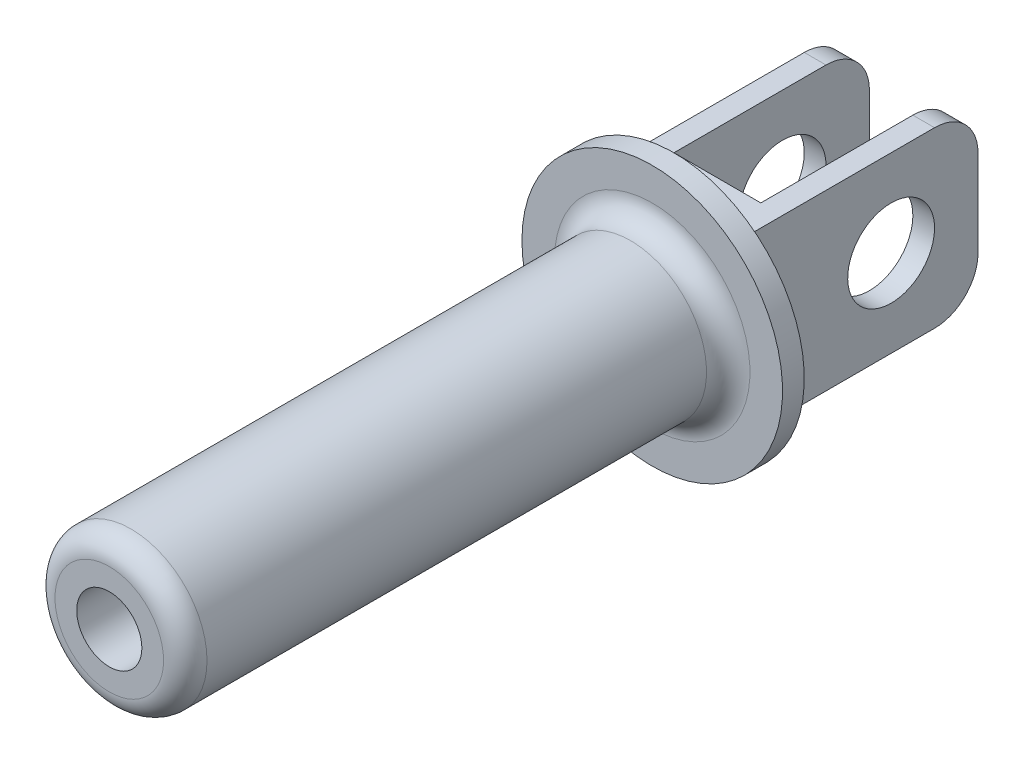
ISO-10303-21;
HEADER;
FILE_DESCRIPTION(('STEP AP214'),'2;1');
FILE_NAME('part.step','',(''),(''),'','','');
FILE_SCHEMA(('AUTOMOTIVE_DESIGN { 1 0 10303 214 1 1 1 1 }'));
ENDSEC;
DATA;
#1=APPLICATION_CONTEXT('core data for automotive mechanical design processes');
#2=APPLICATION_PROTOCOL_DEFINITION('international standard','automotive_design',2000,#1);
#3=PRODUCT_CONTEXT('',#1,'mechanical');
#4=PRODUCT('Part','Part','',(#3));
#5=PRODUCT_RELATED_PRODUCT_CATEGORY('part','',(#4));
#6=PRODUCT_DEFINITION_FORMATION('','',#4);
#7=PRODUCT_DEFINITION_CONTEXT('part definition',#1,'design');
#8=PRODUCT_DEFINITION('design','',#6,#7);
#9=PRODUCT_DEFINITION_SHAPE('','',#8);
#10=(LENGTH_UNIT() NAMED_UNIT(*) SI_UNIT(.MILLI.,.METRE.));
#11=(NAMED_UNIT(*) PLANE_ANGLE_UNIT() SI_UNIT($,.RADIAN.));
#12=(NAMED_UNIT(*) SI_UNIT($,.STERADIAN.) SOLID_ANGLE_UNIT());
#13=UNCERTAINTY_MEASURE_WITH_UNIT(LENGTH_MEASURE(1.E-05),#10,'distance_accuracy_value','');
#14=(GEOMETRIC_REPRESENTATION_CONTEXT(3) GLOBAL_UNCERTAINTY_ASSIGNED_CONTEXT((#13)) GLOBAL_UNIT_ASSIGNED_CONTEXT((#10,
#11,#12)) REPRESENTATION_CONTEXT('',''));
#15=CARTESIAN_POINT('',(0.,0.,0.));
#16=DIRECTION('',(0.,0.,1.));
#17=DIRECTION('',(1.,0.,0.));
#18=AXIS2_PLACEMENT_3D('',#15,#16,#17);
#19=CARTESIAN_POINT('',(0.,0.,-30.));
#20=DIRECTION('',(0.,0.,-1.));
#21=DIRECTION('',(-1.,0.,0.));
#22=AXIS2_PLACEMENT_3D('',#19,#20,#21);
#23=PLANE('',#22);
#24=DIRECTION('',(0.,1.,0.));
#25=VECTOR('',#24,1.);
#26=CARTESIAN_POINT('',(-7.5,10.,-30.));
#27=LINE('',#26,#25);
#28=CARTESIAN_POINT('',(-7.5,-5.,-30.));
#29=VERTEX_POINT('',#28);
#30=CARTESIAN_POINT('',(-7.5,5.,-30.));
#31=VERTEX_POINT('',#30);
#32=EDGE_CURVE('E169',#29,#31,#27,.T.);
#33=ORIENTED_EDGE('',*,*,#32,.T.);
#34=DIRECTION('',(1.,0.,0.));
#35=VECTOR('',#34,1.);
#36=CARTESIAN_POINT('',(-5.,5.,-30.));
#37=LINE('',#36,#35);
#38=CARTESIAN_POINT('',(-5.,5.,-30.));
#39=VERTEX_POINT('',#38);
#40=EDGE_CURVE('E238',#31,#39,#37,.T.);
#41=ORIENTED_EDGE('',*,*,#40,.T.);
#42=DIRECTION('',(0.,1.,0.));
#43=VECTOR('',#42,1.);
#44=CARTESIAN_POINT('',(-5.,-10.,-30.));
#45=LINE('',#44,#43);
#46=CARTESIAN_POINT('',(-5.,-5.,-30.));
#47=VERTEX_POINT('',#46);
#48=EDGE_CURVE('E149',#47,#39,#45,.T.);
#49=ORIENTED_EDGE('',*,*,#48,.F.);
#50=DIRECTION('',(-1.,0.,0.));
#51=VECTOR('',#50,1.);
#52=CARTESIAN_POINT('',(-7.5,-5.,-30.));
#53=LINE('',#52,#51);
#54=EDGE_CURVE('E236',#47,#29,#53,.T.);
#55=ORIENTED_EDGE('',*,*,#54,.T.);
#56=EDGE_LOOP('',(#33,#41,#49,#55));
#57=FACE_BOUND('',#56,.T.);
#58=ADVANCED_FACE('F39',(#57),#23,.T.);
#59=CARTESIAN_POINT('',(0.,0.,-2.5));
#60=DIRECTION('',(0.,0.,-1.));
#61=DIRECTION('',(-1.,0.,0.));
#62=AXIS2_PLACEMENT_3D('',#59,#60,#61);
#63=PLANE('',#62);
#64=CARTESIAN_POINT('',(0.,0.,-2.5));
#65=DIRECTION('',(0.,0.,-1.));
#66=DIRECTION('',(-1.,0.,0.));
#67=AXIS2_PLACEMENT_3D('',#64,#65,#66);
#68=CIRCLE('',#67,15.);
#69=CARTESIAN_POINT('',(-15.,0.,-2.5));
#70=VERTEX_POINT('',#69);
#71=EDGE_CURVE('E194',#70,#70,#68,.T.);
#72=ORIENTED_EDGE('',*,*,#71,.T.);
#73=EDGE_LOOP('',(#72));
#74=FACE_BOUND('',#73,.T.);
#75=DIRECTION('',(1.,0.,0.));
#76=VECTOR('',#75,1.);
#77=CARTESIAN_POINT('',(7.5,10.,-2.5));
#78=LINE('',#77,#76);
#79=CARTESIAN_POINT('',(-7.5,10.,-2.5));
#80=VERTEX_POINT('',#79);
#81=CARTESIAN_POINT('',(7.5,10.,-2.5));
#82=VERTEX_POINT('',#81);
#83=EDGE_CURVE('E178',#80,#82,#78,.T.);
#84=ORIENTED_EDGE('',*,*,#83,.F.);
#85=DIRECTION('',(0.,1.,0.));
#86=VECTOR('',#85,1.);
#87=CARTESIAN_POINT('',(-7.5,10.,-2.5));
#88=LINE('',#87,#86);
#89=CARTESIAN_POINT('',(-7.5,-10.,-2.5));
#90=VERTEX_POINT('',#89);
#91=EDGE_CURVE('E164',#90,#80,#88,.T.);
#92=ORIENTED_EDGE('',*,*,#91,.F.);
#93=DIRECTION('',(-1.,0.,0.));
#94=VECTOR('',#93,1.);
#95=CARTESIAN_POINT('',(7.5,-10.,-2.5));
#96=LINE('',#95,#94);
#97=CARTESIAN_POINT('',(7.5,-10.,-2.5));
#98=VERTEX_POINT('',#97);
#99=EDGE_CURVE('E172',#98,#90,#96,.T.);
#100=ORIENTED_EDGE('',*,*,#99,.F.);
#101=DIRECTION('',(0.,-1.,0.));
#102=VECTOR('',#101,1.);
#103=CARTESIAN_POINT('',(7.5,10.,-2.5));
#104=LINE('',#103,#102);
#105=EDGE_CURVE('E181',#82,#98,#104,.T.);
#106=ORIENTED_EDGE('',*,*,#105,.F.);
#107=EDGE_LOOP('',(#84,#92,#100,#106));
#108=FACE_BOUND('',#107,.T.);
#109=ADVANCED_FACE('F277',(#74,#108),#63,.T.);
#110=CARTESIAN_POINT('',(0.,0.,62.5));
#111=DIRECTION('',(0.,0.,-1.));
#112=DIRECTION('',(-1.,0.,0.));
#113=AXIS2_PLACEMENT_3D('',#110,#111,#112);
#114=CYLINDRICAL_SURFACE('',#113,8.75);
#115=CARTESIAN_POINT('',(0.,0.,60.));
#116=DIRECTION('',(0.,0.,1.));
#117=DIRECTION('',(1.,0.,0.));
#118=AXIS2_PLACEMENT_3D('',#115,#116,#117);
#119=CIRCLE('',#118,8.75);
#120=CARTESIAN_POINT('',(8.75,0.,60.));
#121=VERTEX_POINT('',#120);
#122=EDGE_CURVE('E212',#121,#121,#119,.F.);
#123=ORIENTED_EDGE('',*,*,#122,.T.);
#124=EDGE_LOOP('',(#123));
#125=FACE_BOUND('',#124,.T.);
#126=CARTESIAN_POINT('',(0.,0.,2.5));
#127=DIRECTION('',(0.,0.,-1.));
#128=DIRECTION('',(-1.,0.,0.));
#129=AXIS2_PLACEMENT_3D('',#126,#127,#128);
#130=CIRCLE('',#129,8.75);
#131=CARTESIAN_POINT('',(-8.75,0.,2.5));
#132=VERTEX_POINT('',#131);
#133=EDGE_CURVE('E206',#132,#132,#130,.F.);
#134=ORIENTED_EDGE('',*,*,#133,.T.);
#135=EDGE_LOOP('',(#134));
#136=FACE_BOUND('',#135,.T.);
#137=ADVANCED_FACE('F283',(#125,#136),#114,.T.);
#138=CARTESIAN_POINT('',(0.,0.,62.5));
#139=DIRECTION('',(0.,0.,1.));
#140=DIRECTION('',(1.,0.,0.));
#141=AXIS2_PLACEMENT_3D('',#138,#139,#140);
#142=PLANE('',#141);
#143=CARTESIAN_POINT('',(0.,0.,62.5));
#144=DIRECTION('',(0.,0.,1.));
#145=DIRECTION('',(1.,0.,0.));
#146=AXIS2_PLACEMENT_3D('',#143,#144,#145);
#147=CIRCLE('',#146,6.25);
#148=CARTESIAN_POINT('',(6.25,0.,62.5));
#149=VERTEX_POINT('',#148);
#150=EDGE_CURVE('E209',#149,#149,#147,.T.);
#151=ORIENTED_EDGE('',*,*,#150,.T.);
#152=EDGE_LOOP('',(#151));
#153=FACE_BOUND('',#152,.T.);
#154=CARTESIAN_POINT('',(0.,0.,62.5));
#155=DIRECTION('',(0.,0.,1.));
#156=DIRECTION('',(1.,0.,0.));
#157=AXIS2_PLACEMENT_3D('',#154,#155,#156);
#158=CIRCLE('',#157,3.75);
#159=CARTESIAN_POINT('',(3.75,0.,62.5));
#160=VERTEX_POINT('',#159);
#161=EDGE_CURVE('E165',#160,#160,#158,.T.);
#162=ORIENTED_EDGE('',*,*,#161,.F.);
#163=EDGE_LOOP('',(#162));
#164=FACE_BOUND('',#163,.T.);
#165=ADVANCED_FACE('F340',(#153,#164),#142,.T.);
#166=CARTESIAN_POINT('',(0.,0.,0.));
#167=DIRECTION('',(0.,0.,-1.));
#168=DIRECTION('',(-1.,0.,0.));
#169=AXIS2_PLACEMENT_3D('',#166,#167,#168);
#170=PLANE('',#169);
#171=CARTESIAN_POINT('',(0.,0.,0.));
#172=DIRECTION('',(0.,0.,-1.));
#173=DIRECTION('',(-1.,0.,0.));
#174=AXIS2_PLACEMENT_3D('',#171,#172,#173);
#175=CIRCLE('',#174,11.25);
#176=CARTESIAN_POINT('',(-11.25,0.,0.));
#177=VERTEX_POINT('',#176);
#178=EDGE_CURVE('E197',#177,#177,#175,.T.);
#179=ORIENTED_EDGE('',*,*,#178,.T.);
#180=EDGE_LOOP('',(#179));
#181=FACE_BOUND('',#180,.T.);
#182=CARTESIAN_POINT('',(0.,0.,0.));
#183=DIRECTION('',(0.,0.,-1.));
#184=DIRECTION('',(-1.,0.,0.));
#185=AXIS2_PLACEMENT_3D('',#182,#183,#184);
#186=CIRCLE('',#185,15.);
#187=CARTESIAN_POINT('',(-15.,0.,0.));
#188=VERTEX_POINT('',#187);
#189=EDGE_CURVE('E193',#188,#188,#186,.T.);
#190=ORIENTED_EDGE('',*,*,#189,.F.);
#191=EDGE_LOOP('',(#190));
#192=FACE_BOUND('',#191,.T.);
#193=ADVANCED_FACE('F334',(#181,#192),#170,.F.);
#194=CARTESIAN_POINT('',(0.,0.,-2.5));
#195=DIRECTION('',(0.,0.,1.));
#196=DIRECTION('',(1.,0.,0.));
#197=AXIS2_PLACEMENT_3D('',#194,#195,#196);
#198=CYLINDRICAL_SURFACE('',#197,15.);
#199=ORIENTED_EDGE('',*,*,#71,.F.);
#200=EDGE_LOOP('',(#199));
#201=FACE_BOUND('',#200,.T.);
#202=ORIENTED_EDGE('',*,*,#189,.T.);
#203=EDGE_LOOP('',(#202));
#204=FACE_BOUND('',#203,.T.);
#205=ADVANCED_FACE('F327',(#201,#204),#198,.T.);
#206=CARTESIAN_POINT('',(-7.5,10.,-30.));
#207=DIRECTION('',(1.,0.,0.));
#208=DIRECTION('',(0.,1.,0.));
#209=AXIS2_PLACEMENT_3D('',#206,#207,#208);
#210=PLANE('',#209);
#211=CARTESIAN_POINT('',(-7.5,0.,-20.));
#212=DIRECTION('',(1.,0.,0.));
#213=DIRECTION('',(0.,1.,0.));
#214=AXIS2_PLACEMENT_3D('',#211,#212,#213);
#215=CIRCLE('',#214,5.);
#216=CARTESIAN_POINT('',(-7.5,5.,-20.));
#217=VERTEX_POINT('',#216);
#218=EDGE_CURVE('E261',#217,#217,#215,.T.);
#219=ORIENTED_EDGE('',*,*,#218,.T.);
#220=EDGE_LOOP('',(#219));
#221=FACE_BOUND('',#220,.T.);
#222=DIRECTION('',(0.,0.,1.));
#223=VECTOR('',#222,1.);
#224=CARTESIAN_POINT('',(-7.5,10.,-30.));
#225=LINE('',#224,#223);
#226=CARTESIAN_POINT('',(-7.5,10.,-25.));
#227=VERTEX_POINT('',#226);
#228=EDGE_CURVE('E191',#227,#80,#225,.T.);
#229=ORIENTED_EDGE('',*,*,#228,.F.);
#230=CARTESIAN_POINT('',(-7.5,5.,-25.));
#231=DIRECTION('',(1.,0.,0.));
#232=DIRECTION('',(0.,1.,0.));
#233=AXIS2_PLACEMENT_3D('',#230,#231,#232);
#234=CIRCLE('',#233,5.);
#235=EDGE_CURVE('E11',#227,#31,#234,.F.);
#236=ORIENTED_EDGE('',*,*,#235,.T.);
#237=ORIENTED_EDGE('',*,*,#32,.F.);
#238=CARTESIAN_POINT('',(-7.5,-5.,-25.));
#239=DIRECTION('',(1.,0.,0.));
#240=DIRECTION('',(0.,1.,0.));
#241=AXIS2_PLACEMENT_3D('',#238,#239,#240);
#242=CIRCLE('',#241,5.);
#243=CARTESIAN_POINT('',(-7.5,-10.,-25.));
#244=VERTEX_POINT('',#243);
#245=EDGE_CURVE('E47',#29,#244,#242,.F.);
#246=ORIENTED_EDGE('',*,*,#245,.T.);
#247=DIRECTION('',(0.,0.,1.));
#248=VECTOR('',#247,1.);
#249=CARTESIAN_POINT('',(-7.5,-10.,-30.));
#250=LINE('',#249,#248);
#251=EDGE_CURVE('E175',#244,#90,#250,.T.);
#252=ORIENTED_EDGE('',*,*,#251,.T.);
#253=ORIENTED_EDGE('',*,*,#91,.T.);
#254=EDGE_LOOP('',(#229,#236,#237,#246,#252,#253));
#255=FACE_BOUND('',#254,.T.);
#256=ADVANCED_FACE('F245',(#221,#255),#210,.F.);
#257=CARTESIAN_POINT('',(7.5,10.,-30.));
#258=DIRECTION('',(0.,-1.,0.));
#259=DIRECTION('',(0.,0.,-1.));
#260=AXIS2_PLACEMENT_3D('',#257,#258,#259);
#261=PLANE('',#260);
#262=DIRECTION('',(0.,0.,1.));
#263=VECTOR('',#262,1.);
#264=CARTESIAN_POINT('',(7.5,10.,-30.));
#265=LINE('',#264,#263);
#266=CARTESIAN_POINT('',(7.5,10.,-25.));
#267=VERTEX_POINT('',#266);
#268=EDGE_CURVE('E189',#267,#82,#265,.T.);
#269=ORIENTED_EDGE('',*,*,#268,.F.);
#270=DIRECTION('',(1.,0.,0.));
#271=VECTOR('',#270,1.);
#272=CARTESIAN_POINT('',(5.,10.,-25.));
#273=LINE('',#272,#271);
#274=CARTESIAN_POINT('',(5.,10.,-25.));
#275=VERTEX_POINT('',#274);
#276=EDGE_CURVE('E154',#267,#275,#273,.F.);
#277=ORIENTED_EDGE('',*,*,#276,.T.);
#278=DIRECTION('',(0.,0.,-1.));
#279=VECTOR('',#278,1.);
#280=CARTESIAN_POINT('',(5.,10.,-7.5));
#281=LINE('',#280,#279);
#282=CARTESIAN_POINT('',(5.,10.,-7.5));
#283=VERTEX_POINT('',#282);
#284=EDGE_CURVE('E133',#283,#275,#281,.T.);
#285=ORIENTED_EDGE('',*,*,#284,.F.);
#286=DIRECTION('',(1.,0.,0.));
#287=VECTOR('',#286,1.);
#288=CARTESIAN_POINT('',(-5.,10.,-7.5));
#289=LINE('',#288,#287);
#290=CARTESIAN_POINT('',(-5.,10.,-7.5));
#291=VERTEX_POINT('',#290);
#292=EDGE_CURVE('E140',#291,#283,#289,.T.);
#293=ORIENTED_EDGE('',*,*,#292,.F.);
#294=DIRECTION('',(0.,0.,-1.));
#295=VECTOR('',#294,1.);
#296=CARTESIAN_POINT('',(-5.,10.,-7.5));
#297=LINE('',#296,#295);
#298=CARTESIAN_POINT('',(-5.,10.,-25.));
#299=VERTEX_POINT('',#298);
#300=EDGE_CURVE('E168',#291,#299,#297,.T.);
#301=ORIENTED_EDGE('',*,*,#300,.T.);
#302=DIRECTION('',(1.,0.,0.));
#303=VECTOR('',#302,1.);
#304=CARTESIAN_POINT('',(-7.5,10.,-25.));
#305=LINE('',#304,#303);
#306=EDGE_CURVE('E233',#299,#227,#305,.F.);
#307=ORIENTED_EDGE('',*,*,#306,.T.);
#308=ORIENTED_EDGE('',*,*,#228,.T.);
#309=ORIENTED_EDGE('',*,*,#83,.T.);
#310=EDGE_LOOP('',(#269,#277,#285,#293,#301,#307,#308,#309));
#311=FACE_BOUND('',#310,.T.);
#312=ADVANCED_FACE('F152',(#311),#261,.F.);
#313=CARTESIAN_POINT('',(7.5,10.,-30.));
#314=DIRECTION('',(-1.,0.,0.));
#315=DIRECTION('',(0.,-1.,0.));
#316=AXIS2_PLACEMENT_3D('',#313,#314,#315);
#317=PLANE('',#316);
#318=CARTESIAN_POINT('',(7.5,0.,-20.));
#319=DIRECTION('',(-1.,0.,0.));
#320=DIRECTION('',(0.,-1.,0.));
#321=AXIS2_PLACEMENT_3D('',#318,#319,#320);
#322=CIRCLE('',#321,5.);
#323=CARTESIAN_POINT('',(7.5,5.,-20.));
#324=VERTEX_POINT('',#323);
#325=EDGE_CURVE('E311',#324,#324,#322,.T.);
#326=ORIENTED_EDGE('',*,*,#325,.T.);
#327=EDGE_LOOP('',(#326));
#328=FACE_BOUND('',#327,.T.);
#329=DIRECTION('',(0.,0.,1.));
#330=VECTOR('',#329,1.);
#331=CARTESIAN_POINT('',(7.5,-10.,-30.));
#332=LINE('',#331,#330);
#333=CARTESIAN_POINT('',(7.5,-10.,-25.));
#334=VERTEX_POINT('',#333);
#335=EDGE_CURVE('E187',#334,#98,#332,.T.);
#336=ORIENTED_EDGE('',*,*,#335,.F.);
#337=CARTESIAN_POINT('',(7.5,-5.,-25.));
#338=DIRECTION('',(-1.,0.,0.));
#339=DIRECTION('',(0.,-1.,0.));
#340=AXIS2_PLACEMENT_3D('',#337,#338,#339);
#341=CIRCLE('',#340,5.);
#342=CARTESIAN_POINT('',(7.5,-5.,-30.));
#343=VERTEX_POINT('',#342);
#344=EDGE_CURVE('E231',#334,#343,#341,.F.);
#345=ORIENTED_EDGE('',*,*,#344,.T.);
#346=DIRECTION('',(0.,-1.,0.));
#347=VECTOR('',#346,1.);
#348=CARTESIAN_POINT('',(7.5,10.,-30.));
#349=LINE('',#348,#347);
#350=CARTESIAN_POINT('',(7.5,5.,-30.));
#351=VERTEX_POINT('',#350);
#352=EDGE_CURVE('E171',#351,#343,#349,.T.);
#353=ORIENTED_EDGE('',*,*,#352,.F.);
#354=CARTESIAN_POINT('',(7.5,5.,-25.));
#355=DIRECTION('',(-1.,0.,0.));
#356=DIRECTION('',(0.,-1.,0.));
#357=AXIS2_PLACEMENT_3D('',#354,#355,#356);
#358=CIRCLE('',#357,5.);
#359=EDGE_CURVE('E229',#351,#267,#358,.F.);
#360=ORIENTED_EDGE('',*,*,#359,.T.);
#361=ORIENTED_EDGE('',*,*,#268,.T.);
#362=ORIENTED_EDGE('',*,*,#105,.T.);
#363=EDGE_LOOP('',(#336,#345,#353,#360,#361,#362));
#364=FACE_BOUND('',#363,.T.);
#365=ADVANCED_FACE('F297',(#328,#364),#317,.F.);
#366=CARTESIAN_POINT('',(7.5,-10.,-30.));
#367=DIRECTION('',(0.,1.,0.));
#368=DIRECTION('',(0.,0.,1.));
#369=AXIS2_PLACEMENT_3D('',#366,#367,#368);
#370=PLANE('',#369);
#371=DIRECTION('',(0.,0.,-1.));
#372=VECTOR('',#371,1.);
#373=CARTESIAN_POINT('',(5.,-10.,-7.5));
#374=LINE('',#373,#372);
#375=CARTESIAN_POINT('',(5.,-10.,-7.5));
#376=VERTEX_POINT('',#375);
#377=CARTESIAN_POINT('',(5.,-10.,-25.));
#378=VERTEX_POINT('',#377);
#379=EDGE_CURVE('E136',#376,#378,#374,.T.);
#380=ORIENTED_EDGE('',*,*,#379,.T.);
#381=DIRECTION('',(-1.,0.,0.));
#382=VECTOR('',#381,1.);
#383=CARTESIAN_POINT('',(7.5,-10.,-25.));
#384=LINE('',#383,#382);
#385=EDGE_CURVE('E227',#378,#334,#384,.F.);
#386=ORIENTED_EDGE('',*,*,#385,.T.);
#387=ORIENTED_EDGE('',*,*,#335,.T.);
#388=ORIENTED_EDGE('',*,*,#99,.T.);
#389=ORIENTED_EDGE('',*,*,#251,.F.);
#390=DIRECTION('',(-1.,0.,0.));
#391=VECTOR('',#390,1.);
#392=CARTESIAN_POINT('',(-5.,-10.,-25.));
#393=LINE('',#392,#391);
#394=CARTESIAN_POINT('',(-5.,-10.,-25.));
#395=VERTEX_POINT('',#394);
#396=EDGE_CURVE('E225',#244,#395,#393,.F.);
#397=ORIENTED_EDGE('',*,*,#396,.T.);
#398=DIRECTION('',(0.,0.,-1.));
#399=VECTOR('',#398,1.);
#400=CARTESIAN_POINT('',(-5.,-10.,-7.5));
#401=LINE('',#400,#399);
#402=CARTESIAN_POINT('',(-5.,-10.,-7.5));
#403=VERTEX_POINT('',#402);
#404=EDGE_CURVE('E156',#403,#395,#401,.T.);
#405=ORIENTED_EDGE('',*,*,#404,.F.);
#406=DIRECTION('',(-1.,0.,0.));
#407=VECTOR('',#406,1.);
#408=CARTESIAN_POINT('',(5.,-10.,-7.5));
#409=LINE('',#408,#407);
#410=EDGE_CURVE('E139',#376,#403,#409,.T.);
#411=ORIENTED_EDGE('',*,*,#410,.F.);
#412=EDGE_LOOP('',(#380,#386,#387,#388,#389,#397,#405,#411));
#413=FACE_BOUND('',#412,.T.);
#414=ADVANCED_FACE('F247',(#413),#370,.F.);
#415=ORIENTED_EDGE('',*,*,#352,.T.);
#416=DIRECTION('',(-1.,0.,0.));
#417=VECTOR('',#416,1.);
#418=CARTESIAN_POINT('',(5.,-5.,-30.));
#419=LINE('',#418,#417);
#420=CARTESIAN_POINT('',(5.,-5.,-30.));
#421=VERTEX_POINT('',#420);
#422=EDGE_CURVE('E218',#343,#421,#419,.T.);
#423=ORIENTED_EDGE('',*,*,#422,.T.);
#424=DIRECTION('',(0.,-1.,0.));
#425=VECTOR('',#424,1.);
#426=CARTESIAN_POINT('',(5.,10.,-30.));
#427=LINE('',#426,#425);
#428=CARTESIAN_POINT('',(5.,5.,-30.));
#429=VERTEX_POINT('',#428);
#430=EDGE_CURVE('E259',#429,#421,#427,.T.);
#431=ORIENTED_EDGE('',*,*,#430,.F.);
#432=DIRECTION('',(1.,0.,0.));
#433=VECTOR('',#432,1.);
#434=CARTESIAN_POINT('',(7.5,5.,-30.));
#435=LINE('',#434,#433);
#436=EDGE_CURVE('E215',#429,#351,#435,.T.);
#437=ORIENTED_EDGE('',*,*,#436,.T.);
#438=EDGE_LOOP('',(#415,#423,#431,#437));
#439=FACE_BOUND('',#438,.T.);
#440=ADVANCED_FACE('F279',(#439),#23,.T.);
#441=CARTESIAN_POINT('',(0.,0.,27.5));
#442=DIRECTION('',(0.,0.,1.));
#443=DIRECTION('',(1.,0.,0.));
#444=AXIS2_PLACEMENT_3D('',#441,#442,#443);
#445=CYLINDRICAL_SURFACE('',#444,3.75);
#446=CARTESIAN_POINT('',(0.,0.,27.5));
#447=DIRECTION('',(0.,0.,1.));
#448=DIRECTION('',(1.,0.,0.));
#449=AXIS2_PLACEMENT_3D('',#446,#447,#448);
#450=CIRCLE('',#449,3.75);
#451=CARTESIAN_POINT('',(3.75,0.,27.5));
#452=VERTEX_POINT('',#451);
#453=EDGE_CURVE('E161',#452,#452,#450,.T.);
#454=ORIENTED_EDGE('',*,*,#453,.F.);
#455=EDGE_LOOP('',(#454));
#456=FACE_BOUND('',#455,.T.);
#457=ORIENTED_EDGE('',*,*,#161,.T.);
#458=EDGE_LOOP('',(#457));
#459=FACE_BOUND('',#458,.T.);
#460=ADVANCED_FACE('F289',(#456,#459),#445,.F.);
#461=CARTESIAN_POINT('',(0.,0.,27.5));
#462=DIRECTION('',(0.,0.,1.));
#463=DIRECTION('',(1.,0.,0.));
#464=AXIS2_PLACEMENT_3D('',#461,#462,#463);
#465=PLANE('',#464);
#466=ORIENTED_EDGE('',*,*,#453,.T.);
#467=EDGE_LOOP('',(#466));
#468=FACE_BOUND('',#467,.T.);
#469=ADVANCED_FACE('F295',(#468),#465,.T.);
#470=CARTESIAN_POINT('',(-5.,-10.,-7.5));
#471=DIRECTION('',(-1.,0.,0.));
#472=DIRECTION('',(0.,0.,1.));
#473=AXIS2_PLACEMENT_3D('',#470,#471,#472);
#474=PLANE('',#473);
#475=CARTESIAN_POINT('',(-5.,0.,-20.));
#476=DIRECTION('',(-1.,0.,0.));
#477=DIRECTION('',(0.,0.,1.));
#478=AXIS2_PLACEMENT_3D('',#475,#476,#477);
#479=CIRCLE('',#478,5.);
#480=CARTESIAN_POINT('',(-5.,5.,-20.));
#481=VERTEX_POINT('',#480);
#482=EDGE_CURVE('E203',#481,#481,#479,.T.);
#483=ORIENTED_EDGE('',*,*,#482,.T.);
#484=EDGE_LOOP('',(#483));
#485=FACE_BOUND('',#484,.T.);
#486=ORIENTED_EDGE('',*,*,#48,.T.);
#487=CARTESIAN_POINT('',(-5.,5.,-25.));
#488=DIRECTION('',(-1.,0.,0.));
#489=DIRECTION('',(0.,0.,1.));
#490=AXIS2_PLACEMENT_3D('',#487,#488,#489);
#491=CIRCLE('',#490,5.);
#492=EDGE_CURVE('E243',#39,#299,#491,.F.);
#493=ORIENTED_EDGE('',*,*,#492,.T.);
#494=ORIENTED_EDGE('',*,*,#300,.F.);
#495=DIRECTION('',(0.,1.,0.));
#496=VECTOR('',#495,1.);
#497=CARTESIAN_POINT('',(-5.,-10.,-7.5));
#498=LINE('',#497,#496);
#499=EDGE_CURVE('E146',#403,#291,#498,.T.);
#500=ORIENTED_EDGE('',*,*,#499,.F.);
#501=ORIENTED_EDGE('',*,*,#404,.T.);
#502=CARTESIAN_POINT('',(-5.,-5.,-25.));
#503=DIRECTION('',(-1.,0.,0.));
#504=DIRECTION('',(0.,0.,1.));
#505=AXIS2_PLACEMENT_3D('',#502,#503,#504);
#506=CIRCLE('',#505,5.);
#507=EDGE_CURVE('E241',#395,#47,#506,.F.);
#508=ORIENTED_EDGE('',*,*,#507,.T.);
#509=EDGE_LOOP('',(#486,#493,#494,#500,#501,#508));
#510=FACE_BOUND('',#509,.T.);
#511=ADVANCED_FACE('F256',(#485,#510),#474,.F.);
#512=CARTESIAN_POINT('',(5.,10.,-7.5));
#513=DIRECTION('',(1.,0.,0.));
#514=DIRECTION('',(0.,1.,0.));
#515=AXIS2_PLACEMENT_3D('',#512,#513,#514);
#516=PLANE('',#515);
#517=CARTESIAN_POINT('',(5.,0.,-20.));
#518=DIRECTION('',(1.,0.,0.));
#519=DIRECTION('',(0.,1.,0.));
#520=AXIS2_PLACEMENT_3D('',#517,#518,#519);
#521=CIRCLE('',#520,5.);
#522=CARTESIAN_POINT('',(5.,5.,-20.));
#523=VERTEX_POINT('',#522);
#524=EDGE_CURVE('E200',#523,#523,#521,.T.);
#525=ORIENTED_EDGE('',*,*,#524,.T.);
#526=EDGE_LOOP('',(#525));
#527=FACE_BOUND('',#526,.T.);
#528=ORIENTED_EDGE('',*,*,#430,.T.);
#529=CARTESIAN_POINT('',(5.,-5.,-25.));
#530=DIRECTION('',(1.,0.,0.));
#531=DIRECTION('',(0.,1.,0.));
#532=AXIS2_PLACEMENT_3D('',#529,#530,#531);
#533=CIRCLE('',#532,5.);
#534=EDGE_CURVE('E223',#421,#378,#533,.F.);
#535=ORIENTED_EDGE('',*,*,#534,.T.);
#536=ORIENTED_EDGE('',*,*,#379,.F.);
#537=DIRECTION('',(0.,-1.,0.));
#538=VECTOR('',#537,1.);
#539=CARTESIAN_POINT('',(5.,10.,-7.5));
#540=LINE('',#539,#538);
#541=EDGE_CURVE('E128',#283,#376,#540,.T.);
#542=ORIENTED_EDGE('',*,*,#541,.F.);
#543=ORIENTED_EDGE('',*,*,#284,.T.);
#544=CARTESIAN_POINT('',(5.,5.,-25.));
#545=DIRECTION('',(1.,0.,0.));
#546=DIRECTION('',(0.,1.,0.));
#547=AXIS2_PLACEMENT_3D('',#544,#545,#546);
#548=CIRCLE('',#547,5.);
#549=EDGE_CURVE('E221',#275,#429,#548,.F.);
#550=ORIENTED_EDGE('',*,*,#549,.T.);
#551=EDGE_LOOP('',(#528,#535,#536,#542,#543,#550));
#552=FACE_BOUND('',#551,.T.);
#553=ADVANCED_FACE('F131',(#527,#552),#516,.F.);
#554=CARTESIAN_POINT('',(0.,0.,-7.5));
#555=DIRECTION('',(0.,0.,-1.));
#556=DIRECTION('',(-1.,0.,0.));
#557=AXIS2_PLACEMENT_3D('',#554,#555,#556);
#558=PLANE('',#557);
#559=ORIENTED_EDGE('',*,*,#292,.T.);
#560=ORIENTED_EDGE('',*,*,#541,.T.);
#561=ORIENTED_EDGE('',*,*,#410,.T.);
#562=ORIENTED_EDGE('',*,*,#499,.T.);
#563=EDGE_LOOP('',(#559,#560,#561,#562));
#564=FACE_BOUND('',#563,.T.);
#565=ADVANCED_FACE('F144',(#564),#558,.T.);
#566=CARTESIAN_POINT('',(-15.,0.,-20.));
#567=DIRECTION('',(1.,0.,0.));
#568=DIRECTION('',(0.,1.,0.));
#569=AXIS2_PLACEMENT_3D('',#566,#567,#568);
#570=CYLINDRICAL_SURFACE('',#569,5.);
#571=CARTESIAN_POINT('',(5.,5.,-20.));
#572=CARTESIAN_POINT('',(5.02604166666667,5.,-20.));
#573=CARTESIAN_POINT('',(5.05208333333333,5.,-20.));
#574=CARTESIAN_POINT('',(5.10416666666667,5.,-20.));
#575=CARTESIAN_POINT('',(5.13020833333333,5.,-20.));
#576=CARTESIAN_POINT('',(5.18229166666667,5.,-20.));
#577=CARTESIAN_POINT('',(5.20833333333334,5.,-20.));
#578=CARTESIAN_POINT('',(5.26041666666667,5.,-20.));
#579=CARTESIAN_POINT('',(5.28645833333333,5.,-20.));
#580=CARTESIAN_POINT('',(5.33854166666667,5.,-20.));
#581=CARTESIAN_POINT('',(5.36458333333333,5.,-20.));
#582=CARTESIAN_POINT('',(5.41666666666667,5.,-20.));
#583=CARTESIAN_POINT('',(5.44270833333333,5.,-20.));
#584=CARTESIAN_POINT('',(5.49479166666667,5.,-20.));
#585=CARTESIAN_POINT('',(5.52083333333334,5.,-20.));
#586=CARTESIAN_POINT('',(5.57291666666667,5.,-20.));
#587=CARTESIAN_POINT('',(5.59895833333333,5.,-20.));
#588=CARTESIAN_POINT('',(5.65104166666667,5.,-20.));
#589=CARTESIAN_POINT('',(5.67708333333333,5.,-20.));
#590=CARTESIAN_POINT('',(5.72916666666667,5.,-20.));
#591=CARTESIAN_POINT('',(5.75520833333333,5.,-20.));
#592=CARTESIAN_POINT('',(5.80729166666667,5.,-20.));
#593=CARTESIAN_POINT('',(5.83333333333334,5.,-20.));
#594=CARTESIAN_POINT('',(5.88541666666667,5.,-20.));
#595=CARTESIAN_POINT('',(5.91145833333334,5.,-20.));
#596=CARTESIAN_POINT('',(5.96354166666667,5.,-20.));
#597=CARTESIAN_POINT('',(5.98958333333333,5.,-20.));
#598=CARTESIAN_POINT('',(6.04166666666667,5.,-20.));
#599=CARTESIAN_POINT('',(6.06770833333333,5.,-20.));
#600=CARTESIAN_POINT('',(6.11979166666667,5.,-20.));
#601=CARTESIAN_POINT('',(6.14583333333334,5.,-20.));
#602=CARTESIAN_POINT('',(6.19791666666667,5.,-20.));
#603=CARTESIAN_POINT('',(6.22395833333334,5.,-20.));
#604=CARTESIAN_POINT('',(6.27604166666667,5.,-20.));
#605=CARTESIAN_POINT('',(6.30208333333333,5.,-20.));
#606=CARTESIAN_POINT('',(6.35416666666667,5.,-20.));
#607=CARTESIAN_POINT('',(6.38020833333333,5.,-20.));
#608=CARTESIAN_POINT('',(6.43229166666667,5.,-20.));
#609=CARTESIAN_POINT('',(6.45833333333334,5.,-20.));
#610=CARTESIAN_POINT('',(6.51041666666667,5.,-20.));
#611=CARTESIAN_POINT('',(6.53645833333334,5.,-20.));
#612=CARTESIAN_POINT('',(6.58854166666667,5.,-20.));
#613=CARTESIAN_POINT('',(6.61458333333333,5.,-20.));
#614=CARTESIAN_POINT('',(6.66666666666667,5.,-20.));
#615=CARTESIAN_POINT('',(6.69270833333333,5.,-20.));
#616=CARTESIAN_POINT('',(6.74479166666667,5.,-20.));
#617=CARTESIAN_POINT('',(6.77083333333334,5.,-20.));
#618=CARTESIAN_POINT('',(6.82291666666667,5.,-20.));
#619=CARTESIAN_POINT('',(6.84895833333334,5.,-20.));
#620=CARTESIAN_POINT('',(6.90104166666667,5.,-20.));
#621=CARTESIAN_POINT('',(6.92708333333333,5.,-20.));
#622=CARTESIAN_POINT('',(6.97916666666667,5.,-20.));
#623=CARTESIAN_POINT('',(7.00520833333334,5.,-20.));
#624=CARTESIAN_POINT('',(7.05729166666667,5.,-20.));
#625=CARTESIAN_POINT('',(7.08333333333334,5.,-20.));
#626=CARTESIAN_POINT('',(7.13541666666667,5.,-20.));
#627=CARTESIAN_POINT('',(7.16145833333334,5.,-20.));
#628=CARTESIAN_POINT('',(7.21354166666667,5.,-20.));
#629=CARTESIAN_POINT('',(7.23958333333333,5.,-20.));
#630=CARTESIAN_POINT('',(7.29166666666667,5.,-20.));
#631=CARTESIAN_POINT('',(7.31770833333334,5.,-20.));
#632=CARTESIAN_POINT('',(7.36979166666667,5.,-20.));
#633=CARTESIAN_POINT('',(7.39583333333334,5.,-20.));
#634=CARTESIAN_POINT('',(7.44791666666667,5.,-20.));
#635=CARTESIAN_POINT('',(7.47395833333334,5.,-20.));
#636=CARTESIAN_POINT('',(7.5,5.,-20.));
#637=B_SPLINE_CURVE_WITH_KNOTS('',3,(#571,#572,#573,#574,#575,#576,#577,#578,#579,#580,#581,
#582,#583,#584,#585,#586,#587,#588,#589,#590,#591,#592,#593,#594,#595,#596,#597,#598,#599,#600,
#601,#602,#603,#604,#605,#606,#607,#608,#609,#610,#611,#612,#613,#614,#615,#616,#617,#618,#619,
#620,#621,#622,#623,#624,#625,#626,#627,#628,#629,#630,#631,#632,#633,#634,#635,#636),
.UNSPECIFIED.,.F.,.F.,(4,2,2,2,2,2,2,2,2,2,2,2,2,2,2,2,2,2,2,2,2,2,2,2,2,2,2,2,2,2,2,2,4),(0.,
0.0781249999999983,0.15625,0.234375000000002,0.3125,0.390624999999999,0.46875,0.546875000000002,
0.625000000000001,0.703124999999999,0.781250000000001,0.859375000000002,0.937500000000001,
1.015625,1.09375,1.171875,1.25,1.328125,1.40625,1.484375,1.5625,1.640625,1.71875,1.796875,1.875,
1.953125,2.03125,2.109375,2.1875,2.265625,2.34375,2.421875,2.5),.UNSPECIFIED.);
#638=EDGE_CURVE('BSEAM322',#523,#324,#637,.T.);
#639=ORIENTED_EDGE('',*,*,#524,.F.);
#640=ORIENTED_EDGE('',*,*,#325,.F.);
#641=ORIENTED_EDGE('',*,*,#638,.T.);
#642=ORIENTED_EDGE('',*,*,#638,.F.);
#643=EDGE_LOOP('',(#639,#641,#640,#642));
#644=FACE_BOUND('',#643,.T.);
#645=ADVANCED_FACE('F322',(#644),#570,.F.);
#646=CARTESIAN_POINT('',(-5.,5.,-20.));
#647=CARTESIAN_POINT('',(-5.02604166666667,5.,-20.));
#648=CARTESIAN_POINT('',(-5.05208333333334,5.,-20.));
#649=CARTESIAN_POINT('',(-5.10416666666667,5.,-20.));
#650=CARTESIAN_POINT('',(-5.13020833333334,5.,-20.));
#651=CARTESIAN_POINT('',(-5.18229166666667,5.,-20.));
#652=CARTESIAN_POINT('',(-5.20833333333334,5.,-20.));
#653=CARTESIAN_POINT('',(-5.26041666666667,5.,-20.));
#654=CARTESIAN_POINT('',(-5.28645833333334,5.,-20.));
#655=CARTESIAN_POINT('',(-5.33854166666667,5.,-20.));
#656=CARTESIAN_POINT('',(-5.36458333333334,5.,-20.));
#657=CARTESIAN_POINT('',(-5.41666666666667,5.,-20.));
#658=CARTESIAN_POINT('',(-5.44270833333333,5.,-20.));
#659=CARTESIAN_POINT('',(-5.49479166666667,5.,-20.));
#660=CARTESIAN_POINT('',(-5.52083333333333,5.,-20.));
#661=CARTESIAN_POINT('',(-5.57291666666667,5.,-20.));
#662=CARTESIAN_POINT('',(-5.59895833333333,5.,-20.));
#663=CARTESIAN_POINT('',(-5.65104166666667,5.,-20.));
#664=CARTESIAN_POINT('',(-5.67708333333333,5.,-20.));
#665=CARTESIAN_POINT('',(-5.72916666666667,5.,-20.));
#666=CARTESIAN_POINT('',(-5.75520833333334,5.,-20.));
#667=CARTESIAN_POINT('',(-5.80729166666667,5.,-20.));
#668=CARTESIAN_POINT('',(-5.83333333333334,5.,-20.));
#669=CARTESIAN_POINT('',(-5.88541666666667,5.,-20.));
#670=CARTESIAN_POINT('',(-5.91145833333334,5.,-20.));
#671=CARTESIAN_POINT('',(-5.96354166666667,5.,-20.));
#672=CARTESIAN_POINT('',(-5.98958333333334,5.,-20.));
#673=CARTESIAN_POINT('',(-6.04166666666667,5.,-20.));
#674=CARTESIAN_POINT('',(-6.06770833333334,5.,-20.));
#675=CARTESIAN_POINT('',(-6.11979166666667,5.,-20.));
#676=CARTESIAN_POINT('',(-6.14583333333334,5.,-20.));
#677=CARTESIAN_POINT('',(-6.19791666666667,5.,-20.));
#678=CARTESIAN_POINT('',(-6.22395833333333,5.,-20.));
#679=CARTESIAN_POINT('',(-6.27604166666667,5.,-20.));
#680=CARTESIAN_POINT('',(-6.30208333333333,5.,-20.));
#681=CARTESIAN_POINT('',(-6.35416666666667,5.,-20.));
#682=CARTESIAN_POINT('',(-6.38020833333333,5.,-20.));
#683=CARTESIAN_POINT('',(-6.43229166666667,5.,-20.));
#684=CARTESIAN_POINT('',(-6.45833333333333,5.,-20.));
#685=CARTESIAN_POINT('',(-6.51041666666667,5.,-20.));
#686=CARTESIAN_POINT('',(-6.53645833333333,5.,-20.));
#687=CARTESIAN_POINT('',(-6.58854166666667,5.,-20.));
#688=CARTESIAN_POINT('',(-6.61458333333333,5.,-20.));
#689=CARTESIAN_POINT('',(-6.66666666666667,5.,-20.));
#690=CARTESIAN_POINT('',(-6.69270833333333,5.,-20.));
#691=CARTESIAN_POINT('',(-6.74479166666667,5.,-20.));
#692=CARTESIAN_POINT('',(-6.77083333333333,5.,-20.));
#693=CARTESIAN_POINT('',(-6.82291666666667,5.,-20.));
#694=CARTESIAN_POINT('',(-6.84895833333333,5.,-20.));
#695=CARTESIAN_POINT('',(-6.90104166666667,5.,-20.));
#696=CARTESIAN_POINT('',(-6.92708333333333,5.,-20.));
#697=CARTESIAN_POINT('',(-6.97916666666667,5.,-20.));
#698=CARTESIAN_POINT('',(-7.00520833333333,5.,-20.));
#699=CARTESIAN_POINT('',(-7.05729166666667,5.,-20.));
#700=CARTESIAN_POINT('',(-7.08333333333333,5.,-20.));
#701=CARTESIAN_POINT('',(-7.13541666666667,5.,-20.));
#702=CARTESIAN_POINT('',(-7.16145833333333,5.,-20.));
#703=CARTESIAN_POINT('',(-7.21354166666667,5.,-20.));
#704=CARTESIAN_POINT('',(-7.23958333333333,5.,-20.));
#705=CARTESIAN_POINT('',(-7.29166666666667,5.,-20.));
#706=CARTESIAN_POINT('',(-7.31770833333333,5.,-20.));
#707=CARTESIAN_POINT('',(-7.36979166666667,5.,-20.));
#708=CARTESIAN_POINT('',(-7.39583333333333,5.,-20.));
#709=CARTESIAN_POINT('',(-7.44791666666667,5.,-20.));
#710=CARTESIAN_POINT('',(-7.47395833333333,5.,-20.));
#711=CARTESIAN_POINT('',(-7.5,5.,-20.));
#712=B_SPLINE_CURVE_WITH_KNOTS('',3,(#646,#647,#648,#649,#650,#651,#652,#653,#654,#655,#656,
#657,#658,#659,#660,#661,#662,#663,#664,#665,#666,#667,#668,#669,#670,#671,#672,#673,#674,#675,
#676,#677,#678,#679,#680,#681,#682,#683,#684,#685,#686,#687,#688,#689,#690,#691,#692,#693,#694,
#695,#696,#697,#698,#699,#700,#701,#702,#703,#704,#705,#706,#707,#708,#709,#710,#711),
.UNSPECIFIED.,.F.,.F.,(4,2,2,2,2,2,2,2,2,2,2,2,2,2,2,2,2,2,2,2,2,2,2,2,2,2,2,2,2,2,2,2,4),(0.,
0.0781250000000001,0.15625,0.234375,0.3125,0.390625,0.468749999999999,0.546874999999999,
0.624999999999999,0.703124999999999,0.781249999999999,0.859374999999999,0.937499999999999,
1.015625,1.09375,1.171875,1.25,1.328125,1.40625,1.484375,1.5625,1.640625,1.71875,1.796875,1.875,
1.953125,2.03125,2.109375,2.1875,2.265625,2.34375,2.421875,2.5),.UNSPECIFIED.);
#713=EDGE_CURVE('BSEAM318',#481,#217,#712,.T.);
#714=ORIENTED_EDGE('',*,*,#482,.F.);
#715=ORIENTED_EDGE('',*,*,#218,.F.);
#716=ORIENTED_EDGE('',*,*,#713,.T.);
#717=ORIENTED_EDGE('',*,*,#713,.F.);
#718=EDGE_LOOP('',(#714,#716,#715,#717));
#719=FACE_BOUND('',#718,.T.);
#720=ADVANCED_FACE('F318',(#719),#570,.F.);
#721=CARTESIAN_POINT('',(0.,0.,2.5));
#722=DIRECTION('',(0.,0.,-1.));
#723=DIRECTION('',(-1.,0.,0.));
#724=AXIS2_PLACEMENT_3D('',#721,#722,#723);
#725=TOROIDAL_SURFACE('',#724,11.25,2.5);
#726=ORIENTED_EDGE('',*,*,#133,.F.);
#727=EDGE_LOOP('',(#726));
#728=FACE_BOUND('',#727,.T.);
#729=ORIENTED_EDGE('',*,*,#178,.F.);
#730=EDGE_LOOP('',(#729));
#731=FACE_BOUND('',#730,.T.);
#732=ADVANCED_FACE('F321',(#728,#731),#725,.F.);
#733=CARTESIAN_POINT('',(0.,0.,60.));
#734=DIRECTION('',(0.,0.,1.));
#735=DIRECTION('',(1.,0.,0.));
#736=AXIS2_PLACEMENT_3D('',#733,#734,#735);
#737=TOROIDAL_SURFACE('',#736,6.25,2.5);
#738=ORIENTED_EDGE('',*,*,#122,.F.);
#739=EDGE_LOOP('',(#738));
#740=FACE_BOUND('',#739,.T.);
#741=ORIENTED_EDGE('',*,*,#150,.F.);
#742=EDGE_LOOP('',(#741));
#743=FACE_BOUND('',#742,.T.);
#744=ADVANCED_FACE('F351',(#740,#743),#737,.T.);
#745=CARTESIAN_POINT('',(0.,-5.,-25.));
#746=DIRECTION('',(1.,0.,0.));
#747=DIRECTION('',(0.,0.,-1.));
#748=AXIS2_PLACEMENT_3D('',#745,#746,#747);
#749=CYLINDRICAL_SURFACE('',#748,5.);
#750=ORIENTED_EDGE('',*,*,#344,.F.);
#751=ORIENTED_EDGE('',*,*,#385,.F.);
#752=ORIENTED_EDGE('',*,*,#534,.F.);
#753=ORIENTED_EDGE('',*,*,#422,.F.);
#754=EDGE_LOOP('',(#750,#751,#752,#753));
#755=FACE_BOUND('',#754,.T.);
#756=ADVANCED_FACE('F273',(#755),#749,.T.);
#757=CARTESIAN_POINT('',(0.,5.,-25.));
#758=DIRECTION('',(-1.,0.,0.));
#759=DIRECTION('',(0.,0.,1.));
#760=AXIS2_PLACEMENT_3D('',#757,#758,#759);
#761=CYLINDRICAL_SURFACE('',#760,5.);
#762=ORIENTED_EDGE('',*,*,#549,.F.);
#763=ORIENTED_EDGE('',*,*,#276,.F.);
#764=ORIENTED_EDGE('',*,*,#359,.F.);
#765=ORIENTED_EDGE('',*,*,#436,.F.);
#766=EDGE_LOOP('',(#762,#763,#764,#765));
#767=FACE_BOUND('',#766,.T.);
#768=ADVANCED_FACE('F268',(#767),#761,.T.);
#769=CARTESIAN_POINT('',(0.,5.,-25.));
#770=DIRECTION('',(-1.,0.,0.));
#771=DIRECTION('',(0.,0.,1.));
#772=AXIS2_PLACEMENT_3D('',#769,#770,#771);
#773=CYLINDRICAL_SURFACE('',#772,5.);
#774=ORIENTED_EDGE('',*,*,#235,.F.);
#775=ORIENTED_EDGE('',*,*,#306,.F.);
#776=ORIENTED_EDGE('',*,*,#492,.F.);
#777=ORIENTED_EDGE('',*,*,#40,.F.);
#778=EDGE_LOOP('',(#774,#775,#776,#777));
#779=FACE_BOUND('',#778,.T.);
#780=ADVANCED_FACE('F266',(#779),#773,.T.);
#781=CARTESIAN_POINT('',(0.,-5.,-25.));
#782=DIRECTION('',(1.,0.,0.));
#783=DIRECTION('',(0.,0.,-1.));
#784=AXIS2_PLACEMENT_3D('',#781,#782,#783);
#785=CYLINDRICAL_SURFACE('',#784,5.);
#786=ORIENTED_EDGE('',*,*,#507,.F.);
#787=ORIENTED_EDGE('',*,*,#396,.F.);
#788=ORIENTED_EDGE('',*,*,#245,.F.);
#789=ORIENTED_EDGE('',*,*,#54,.F.);
#790=EDGE_LOOP('',(#786,#787,#788,#789));
#791=FACE_BOUND('',#790,.T.);
#792=ADVANCED_FACE('F41',(#791),#785,.T.);
#793=CLOSED_SHELL('',(#58,#109,#137,#165,#193,#205,#256,#312,#365,#414,#440,#460,#469,#511,#553,
#565,#645,#720,#732,#744,#756,#768,#780,#792));
#794=MANIFOLD_SOLID_BREP('B2',#793);
#795=ADVANCED_BREP_SHAPE_REPRESENTATION('',(#18,#794),#14);
#796=SHAPE_DEFINITION_REPRESENTATION(#9,#795);
ENDSEC;
END-ISO-10303-21;
